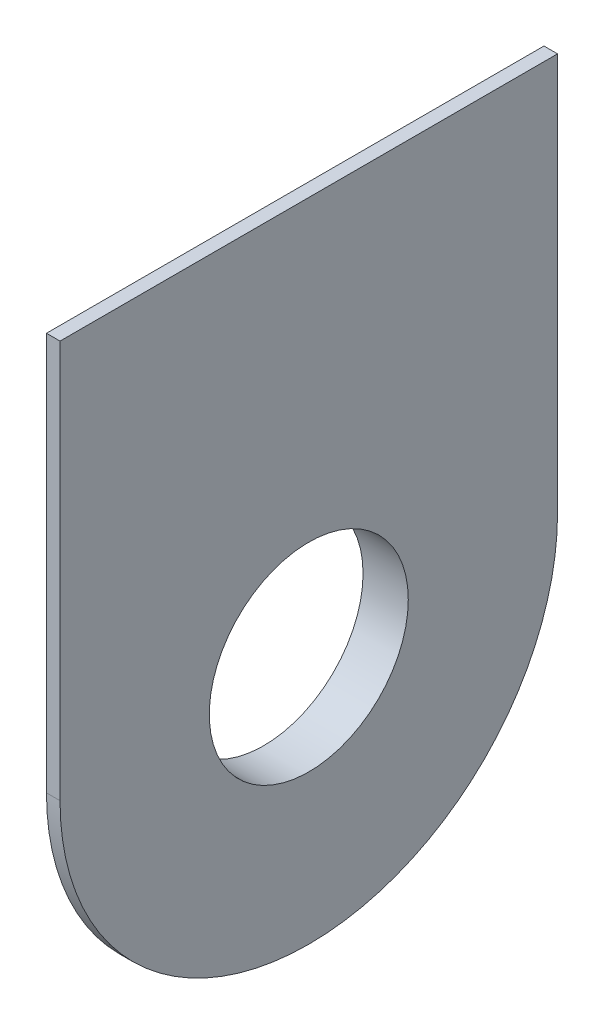
ISO-10303-21;
HEADER;
FILE_DESCRIPTION(('STEP AP214'),'2;1');
FILE_NAME('part.step','',(''),(''),'','','');
FILE_SCHEMA(('AUTOMOTIVE_DESIGN { 1 0 10303 214 1 1 1 1 }'));
ENDSEC;
DATA;
#1=APPLICATION_CONTEXT('core data for automotive mechanical design processes');
#2=APPLICATION_PROTOCOL_DEFINITION('international standard','automotive_design',2000,#1);
#3=PRODUCT_CONTEXT('',#1,'mechanical');
#4=PRODUCT('Part','Part','',(#3));
#5=PRODUCT_RELATED_PRODUCT_CATEGORY('part','',(#4));
#6=PRODUCT_DEFINITION_FORMATION('','',#4);
#7=PRODUCT_DEFINITION_CONTEXT('part definition',#1,'design');
#8=PRODUCT_DEFINITION('design','',#6,#7);
#9=PRODUCT_DEFINITION_SHAPE('','',#8);
#10=(LENGTH_UNIT() NAMED_UNIT(*) SI_UNIT(.MILLI.,.METRE.));
#11=(NAMED_UNIT(*) PLANE_ANGLE_UNIT() SI_UNIT($,.RADIAN.));
#12=(NAMED_UNIT(*) SI_UNIT($,.STERADIAN.) SOLID_ANGLE_UNIT());
#13=UNCERTAINTY_MEASURE_WITH_UNIT(LENGTH_MEASURE(1.E-05),#10,'distance_accuracy_value','');
#14=(GEOMETRIC_REPRESENTATION_CONTEXT(3) GLOBAL_UNCERTAINTY_ASSIGNED_CONTEXT((#13)) GLOBAL_UNIT_ASSIGNED_CONTEXT((#10,
#11,#12)) REPRESENTATION_CONTEXT('',''));
#15=CARTESIAN_POINT('',(0.,0.,0.));
#16=DIRECTION('',(0.,0.,1.));
#17=DIRECTION('',(1.,0.,0.));
#18=AXIS2_PLACEMENT_3D('',#15,#16,#17);
#19=CARTESIAN_POINT('',(75.,-18.3727272727273,-50.));
#20=DIRECTION('',(1.,0.,0.));
#21=DIRECTION('',(0.,0.,-1.));
#22=AXIS2_PLACEMENT_3D('',#19,#20,#21);
#23=PLANE('',#22);
#24=CARTESIAN_POINT('',(75.,-18.3727272727273,-50.));
#25=DIRECTION('',(1.,0.,0.));
#26=DIRECTION('',(0.,0.,-1.));
#27=AXIS2_PLACEMENT_3D('',#24,#25,#26);
#28=CIRCLE('',#27,25.);
#29=CARTESIAN_POINT('',(75.,-18.3727272727273,-75.));
#30=VERTEX_POINT('',#29);
#31=EDGE_CURVE('E37',#30,#30,#28,.T.);
#32=ORIENTED_EDGE('',*,*,#31,.F.);
#33=EDGE_LOOP('',(#32));
#34=FACE_BOUND('',#33,.T.);
#35=CARTESIAN_POINT('',(75.,-18.3727272727273,-50.));
#36=DIRECTION('',(1.,0.,0.));
#37=DIRECTION('',(0.,0.,-1.));
#38=AXIS2_PLACEMENT_3D('',#35,#36,#37);
#39=CIRCLE('',#38,22.);
#40=CARTESIAN_POINT('',(75.,-18.3727272727273,-72.));
#41=VERTEX_POINT('',#40);
#42=EDGE_CURVE('E112',#41,#41,#39,.T.);
#43=ORIENTED_EDGE('',*,*,#42,.T.);
#44=EDGE_LOOP('',(#43));
#45=FACE_BOUND('',#44,.T.);
#46=ADVANCED_FACE('F33',(#34,#45),#23,.F.);
#47=CARTESIAN_POINT('',(82.,-18.3727272727273,-50.));
#48=DIRECTION('',(-1.,0.,0.));
#49=DIRECTION('',(0.,0.,1.));
#50=AXIS2_PLACEMENT_3D('',#47,#48,#49);
#51=CYLINDRICAL_SURFACE('',#50,25.);
#52=CARTESIAN_POINT('',(82.,-18.3727272727273,-50.));
#53=DIRECTION('',(1.,0.,0.));
#54=DIRECTION('',(0.,0.,-1.));
#55=AXIS2_PLACEMENT_3D('',#52,#53,#54);
#56=CIRCLE('',#55,25.);
#57=CARTESIAN_POINT('',(82.,-18.3727272727273,-75.));
#58=VERTEX_POINT('',#57);
#59=EDGE_CURVE('E11',#58,#58,#56,.T.);
#60=ORIENTED_EDGE('',*,*,#59,.F.);
#61=EDGE_LOOP('',(#60));
#62=FACE_BOUND('',#61,.T.);
#63=ORIENTED_EDGE('',*,*,#31,.T.);
#64=EDGE_LOOP('',(#63));
#65=FACE_BOUND('',#64,.T.);
#66=ADVANCED_FACE('F35',(#62,#65),#51,.T.);
#67=CARTESIAN_POINT('',(82.,-18.3727272727273,-50.));
#68=DIRECTION('',(-1.,0.,0.));
#69=DIRECTION('',(0.,0.,1.));
#70=AXIS2_PLACEMENT_3D('',#67,#68,#69);
#71=CYLINDRICAL_SURFACE('',#70,22.);
#72=ORIENTED_EDGE('',*,*,#42,.F.);
#73=EDGE_LOOP('',(#72));
#74=FACE_BOUND('',#73,.T.);
#75=CARTESIAN_POINT('',(85.,-18.3727272727273,-50.));
#76=DIRECTION('',(1.,0.,0.));
#77=DIRECTION('',(0.,0.,-1.));
#78=AXIS2_PLACEMENT_3D('',#75,#76,#77);
#79=CIRCLE('',#78,22.);
#80=CARTESIAN_POINT('',(85.,-18.3727272727273,-72.));
#81=VERTEX_POINT('',#80);
#82=EDGE_CURVE('E105',#81,#81,#79,.T.);
#83=ORIENTED_EDGE('',*,*,#82,.T.);
#84=EDGE_LOOP('',(#83));
#85=FACE_BOUND('',#84,.T.);
#86=ADVANCED_FACE('F124',(#74,#85),#71,.F.);
#87=CARTESIAN_POINT('',(85.,-18.3727272727273,-50.));
#88=DIRECTION('',(1.,0.,0.));
#89=DIRECTION('',(0.,0.,-1.));
#90=AXIS2_PLACEMENT_3D('',#87,#88,#89);
#91=PLANE('',#90);
#92=CARTESIAN_POINT('',(85.,-18.3727272727273,-50.));
#93=DIRECTION('',(1.,0.,0.));
#94=DIRECTION('',(0.,0.,-1.));
#95=AXIS2_PLACEMENT_3D('',#92,#93,#94);
#96=CIRCLE('',#95,55.);
#97=CARTESIAN_POINT('',(85.,-18.3727272727273,5.00000000000001));
#98=VERTEX_POINT('',#97);
#99=CARTESIAN_POINT('',(85.,-18.3727272727273,-105.));
#100=VERTEX_POINT('',#99);
#101=EDGE_CURVE('E87',#98,#100,#96,.T.);
#102=ORIENTED_EDGE('',*,*,#101,.T.);
#103=DIRECTION('',(0.,1.,0.));
#104=VECTOR('',#103,1.);
#105=CARTESIAN_POINT('',(85.,-18.3727272727273,-105.));
#106=LINE('',#105,#104);
#107=CARTESIAN_POINT('',(85.,69.6272727272728,-105.));
#108=VERTEX_POINT('',#107);
#109=EDGE_CURVE('E81',#100,#108,#106,.T.);
#110=ORIENTED_EDGE('',*,*,#109,.T.);
#111=DIRECTION('',(0.,0.,1.));
#112=VECTOR('',#111,1.);
#113=CARTESIAN_POINT('',(85.,69.6272727272728,5.00000000000001));
#114=LINE('',#113,#112);
#115=CARTESIAN_POINT('',(85.,69.6272727272728,5.00000000000001));
#116=VERTEX_POINT('',#115);
#117=EDGE_CURVE('E85',#108,#116,#114,.T.);
#118=ORIENTED_EDGE('',*,*,#117,.T.);
#119=DIRECTION('',(0.,-1.,0.));
#120=VECTOR('',#119,1.);
#121=CARTESIAN_POINT('',(85.,-18.3727272727273,5.00000000000001));
#122=LINE('',#121,#120);
#123=EDGE_CURVE('E50',#116,#98,#122,.T.);
#124=ORIENTED_EDGE('',*,*,#123,.T.);
#125=EDGE_LOOP('',(#102,#110,#118,#124));
#126=FACE_BOUND('',#125,.T.);
#127=ORIENTED_EDGE('',*,*,#82,.F.);
#128=EDGE_LOOP('',(#127));
#129=FACE_BOUND('',#128,.T.);
#130=ADVANCED_FACE('F82',(#126,#129),#91,.T.);
#131=CARTESIAN_POINT('',(82.,-18.3727272727273,-50.));
#132=DIRECTION('',(1.,0.,0.));
#133=DIRECTION('',(0.,0.,-1.));
#134=AXIS2_PLACEMENT_3D('',#131,#132,#133);
#135=PLANE('',#134);
#136=ORIENTED_EDGE('',*,*,#59,.T.);
#137=EDGE_LOOP('',(#136));
#138=FACE_BOUND('',#137,.T.);
#139=CARTESIAN_POINT('',(82.,-18.3727272727273,-50.));
#140=DIRECTION('',(1.,0.,0.));
#141=DIRECTION('',(0.,0.,-1.));
#142=AXIS2_PLACEMENT_3D('',#139,#140,#141);
#143=CIRCLE('',#142,55.);
#144=CARTESIAN_POINT('',(82.,-18.3727272727273,5.00000000000001));
#145=VERTEX_POINT('',#144);
#146=CARTESIAN_POINT('',(82.,-18.3727272727273,-105.));
#147=VERTEX_POINT('',#146);
#148=EDGE_CURVE('E102',#145,#147,#143,.T.);
#149=ORIENTED_EDGE('',*,*,#148,.F.);
#150=DIRECTION('',(0.,-1.,0.));
#151=VECTOR('',#150,1.);
#152=CARTESIAN_POINT('',(82.,-18.3727272727273,5.00000000000001));
#153=LINE('',#152,#151);
#154=CARTESIAN_POINT('',(82.,69.6272727272728,5.00000000000001));
#155=VERTEX_POINT('',#154);
#156=EDGE_CURVE('E73',#155,#145,#153,.T.);
#157=ORIENTED_EDGE('',*,*,#156,.F.);
#158=DIRECTION('',(0.,0.,1.));
#159=VECTOR('',#158,1.);
#160=CARTESIAN_POINT('',(82.,69.6272727272728,5.00000000000001));
#161=LINE('',#160,#159);
#162=CARTESIAN_POINT('',(82.,69.6272727272728,-105.));
#163=VERTEX_POINT('',#162);
#164=EDGE_CURVE('E67',#163,#155,#161,.T.);
#165=ORIENTED_EDGE('',*,*,#164,.F.);
#166=DIRECTION('',(0.,1.,0.));
#167=VECTOR('',#166,1.);
#168=CARTESIAN_POINT('',(82.,-18.3727272727273,-105.));
#169=LINE('',#168,#167);
#170=EDGE_CURVE('E92',#147,#163,#169,.T.);
#171=ORIENTED_EDGE('',*,*,#170,.F.);
#172=EDGE_LOOP('',(#149,#157,#165,#171));
#173=FACE_BOUND('',#172,.T.);
#174=ADVANCED_FACE('F133',(#138,#173),#135,.F.);
#175=CARTESIAN_POINT('',(85.,-18.3727272727273,-50.));
#176=DIRECTION('',(-1.,0.,0.));
#177=DIRECTION('',(0.,0.,1.));
#178=AXIS2_PLACEMENT_3D('',#175,#176,#177);
#179=CYLINDRICAL_SURFACE('',#178,55.);
#180=ORIENTED_EDGE('',*,*,#148,.T.);
#181=DIRECTION('',(-1.,0.,0.));
#182=VECTOR('',#181,1.);
#183=CARTESIAN_POINT('',(85.,-18.3727272727273,-105.));
#184=LINE('',#183,#182);
#185=EDGE_CURVE('E93',#100,#147,#184,.T.);
#186=ORIENTED_EDGE('',*,*,#185,.F.);
#187=ORIENTED_EDGE('',*,*,#101,.F.);
#188=DIRECTION('',(-1.,0.,0.));
#189=VECTOR('',#188,1.);
#190=CARTESIAN_POINT('',(85.,-18.3727272727273,5.00000000000001));
#191=LINE('',#190,#189);
#192=EDGE_CURVE('E98',#98,#145,#191,.T.);
#193=ORIENTED_EDGE('',*,*,#192,.T.);
#194=EDGE_LOOP('',(#180,#186,#187,#193));
#195=FACE_BOUND('',#194,.T.);
#196=ADVANCED_FACE('F130',(#195),#179,.T.);
#197=CARTESIAN_POINT('',(85.,-18.3727272727273,-105.));
#198=DIRECTION('',(0.,0.,1.));
#199=DIRECTION('',(1.,0.,0.));
#200=AXIS2_PLACEMENT_3D('',#197,#198,#199);
#201=PLANE('',#200);
#202=ORIENTED_EDGE('',*,*,#170,.T.);
#203=DIRECTION('',(-1.,0.,0.));
#204=VECTOR('',#203,1.);
#205=CARTESIAN_POINT('',(85.,69.6272727272728,-105.));
#206=LINE('',#205,#204);
#207=EDGE_CURVE('E90',#108,#163,#206,.T.);
#208=ORIENTED_EDGE('',*,*,#207,.F.);
#209=ORIENTED_EDGE('',*,*,#109,.F.);
#210=ORIENTED_EDGE('',*,*,#185,.T.);
#211=EDGE_LOOP('',(#202,#208,#209,#210));
#212=FACE_BOUND('',#211,.T.);
#213=ADVANCED_FACE('F91',(#212),#201,.F.);
#214=CARTESIAN_POINT('',(85.,69.6272727272728,5.00000000000001));
#215=DIRECTION('',(0.,-1.,0.));
#216=DIRECTION('',(0.,0.,-1.));
#217=AXIS2_PLACEMENT_3D('',#214,#215,#216);
#218=PLANE('',#217);
#219=ORIENTED_EDGE('',*,*,#164,.T.);
#220=DIRECTION('',(-1.,0.,0.));
#221=VECTOR('',#220,1.);
#222=CARTESIAN_POINT('',(85.,69.6272727272728,5.00000000000001));
#223=LINE('',#222,#221);
#224=EDGE_CURVE('E94',#116,#155,#223,.T.);
#225=ORIENTED_EDGE('',*,*,#224,.F.);
#226=ORIENTED_EDGE('',*,*,#117,.F.);
#227=ORIENTED_EDGE('',*,*,#207,.T.);
#228=EDGE_LOOP('',(#219,#225,#226,#227));
#229=FACE_BOUND('',#228,.T.);
#230=ADVANCED_FACE('F96',(#229),#218,.F.);
#231=CARTESIAN_POINT('',(85.,-18.3727272727273,5.00000000000001));
#232=DIRECTION('',(0.,0.,-1.));
#233=DIRECTION('',(-1.,0.,0.));
#234=AXIS2_PLACEMENT_3D('',#231,#232,#233);
#235=PLANE('',#234);
#236=ORIENTED_EDGE('',*,*,#156,.T.);
#237=ORIENTED_EDGE('',*,*,#192,.F.);
#238=ORIENTED_EDGE('',*,*,#123,.F.);
#239=ORIENTED_EDGE('',*,*,#224,.T.);
#240=EDGE_LOOP('',(#236,#237,#238,#239));
#241=FACE_BOUND('',#240,.T.);
#242=ADVANCED_FACE('F139',(#241),#235,.F.);
#243=CLOSED_SHELL('',(#46,#66,#86,#130,#174,#196,#213,#230,#242));
#244=MANIFOLD_SOLID_BREP('B2',#243);
#245=ADVANCED_BREP_SHAPE_REPRESENTATION('',(#18,#244),#14);
#246=SHAPE_DEFINITION_REPRESENTATION(#9,#245);
ENDSEC;
END-ISO-10303-21;
